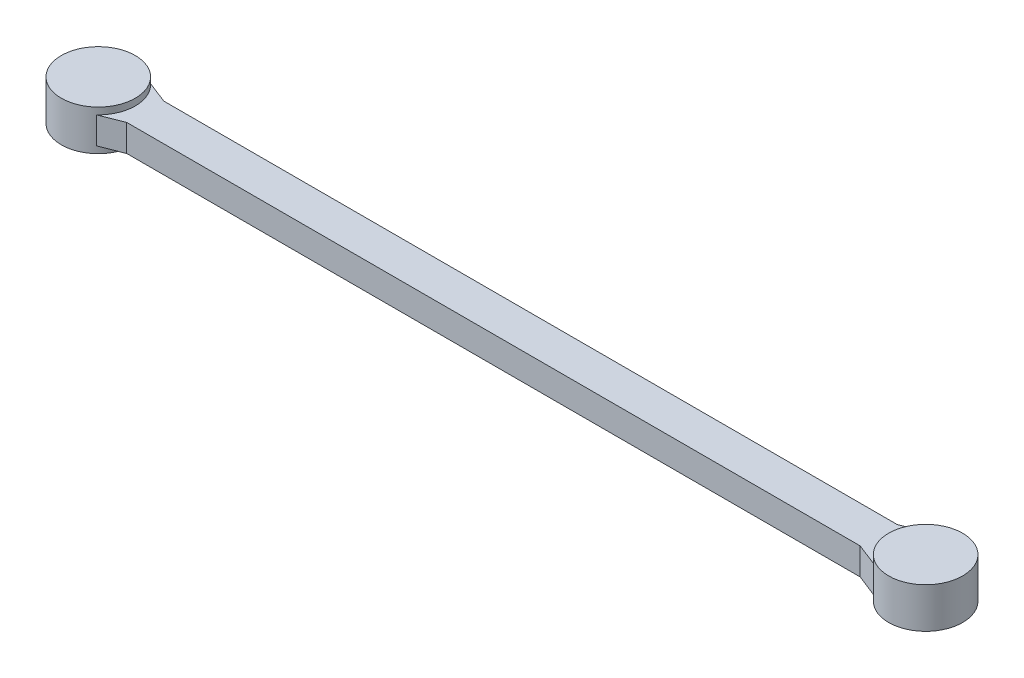
ISO-10303-21;
HEADER;
FILE_DESCRIPTION(('STEP AP214'),'2;1');
FILE_NAME('part.step','',(''),(''),'','','');
FILE_SCHEMA(('AUTOMOTIVE_DESIGN { 1 0 10303 214 1 1 1 1 }'));
ENDSEC;
DATA;
#1=APPLICATION_CONTEXT('core data for automotive mechanical design processes');
#2=APPLICATION_PROTOCOL_DEFINITION('international standard','automotive_design',2000,#1);
#3=PRODUCT_CONTEXT('',#1,'mechanical');
#4=PRODUCT('Part','Part','',(#3));
#5=PRODUCT_RELATED_PRODUCT_CATEGORY('part','',(#4));
#6=PRODUCT_DEFINITION_FORMATION('','',#4);
#7=PRODUCT_DEFINITION_CONTEXT('part definition',#1,'design');
#8=PRODUCT_DEFINITION('design','',#6,#7);
#9=PRODUCT_DEFINITION_SHAPE('','',#8);
#10=(LENGTH_UNIT() NAMED_UNIT(*) SI_UNIT(.MILLI.,.METRE.));
#11=(NAMED_UNIT(*) PLANE_ANGLE_UNIT() SI_UNIT($,.RADIAN.));
#12=(NAMED_UNIT(*) SI_UNIT($,.STERADIAN.) SOLID_ANGLE_UNIT());
#13=UNCERTAINTY_MEASURE_WITH_UNIT(LENGTH_MEASURE(1.E-05),#10,'distance_accuracy_value','');
#14=(GEOMETRIC_REPRESENTATION_CONTEXT(3) GLOBAL_UNCERTAINTY_ASSIGNED_CONTEXT((#13)) GLOBAL_UNIT_ASSIGNED_CONTEXT((#10,
#11,#12)) REPRESENTATION_CONTEXT('',''));
#15=CARTESIAN_POINT('',(0.,0.,0.));
#16=DIRECTION('',(0.,0.,1.));
#17=DIRECTION('',(1.,0.,0.));
#18=AXIS2_PLACEMENT_3D('',#15,#16,#17);
#19=CARTESIAN_POINT('',(545.,40.,0.));
#20=DIRECTION('',(0.366666666666667,0.,0.930352382463524));
#21=DIRECTION('',(0.930352382463524,0.,-0.366666666666667));
#22=AXIS2_PLACEMENT_3D('',#19,#20,#21);
#23=PLANE('',#22);
#24=DIRECTION('',(-0.930352382463524,0.,0.366666666666667));
#25=VECTOR('',#24,1.);
#26=CARTESIAN_POINT('',(545.,40.,0.));
#27=LINE('',#26,#25);
#28=CARTESIAN_POINT('',(577.252215925402,40.,-12.7111111111111));
#29=VERTEX_POINT('',#28);
#30=CARTESIAN_POINT('',(545.,40.,0.));
#31=VERTEX_POINT('',#30);
#32=EDGE_CURVE('E117',#29,#31,#27,.T.);
#33=ORIENTED_EDGE('',*,*,#32,.F.);
#34=DIRECTION('',(0.,1.,0.));
#35=VECTOR('',#34,1.);
#36=CARTESIAN_POINT('',(577.252215925402,-10.,-12.7111111111112));
#37=LINE('',#36,#35);
#38=CARTESIAN_POINT('',(577.252215925402,0.,-12.7111111111111));
#39=VERTEX_POINT('',#38);
#40=EDGE_CURVE('E116',#29,#39,#37,.F.);
#41=ORIENTED_EDGE('',*,*,#40,.T.);
#42=DIRECTION('',(-0.930352382463524,0.,0.366666666666667));
#43=VECTOR('',#42,1.);
#44=CARTESIAN_POINT('',(545.,0.,0.));
#45=LINE('',#44,#43);
#46=CARTESIAN_POINT('',(545.,0.,0.));
#47=VERTEX_POINT('',#46);
#48=EDGE_CURVE('E104',#39,#47,#45,.T.);
#49=ORIENTED_EDGE('',*,*,#48,.T.);
#50=DIRECTION('',(0.,-1.,0.));
#51=VECTOR('',#50,1.);
#52=CARTESIAN_POINT('',(545.,40.,0.));
#53=LINE('',#52,#51);
#54=EDGE_CURVE('E172',#31,#47,#53,.T.);
#55=ORIENTED_EDGE('',*,*,#54,.F.);
#56=EDGE_LOOP('',(#33,#41,#49,#55));
#57=FACE_BOUND('',#56,.T.);
#58=ADVANCED_FACE('F39',(#57),#23,.F.);
#59=CARTESIAN_POINT('',(-545.,40.,0.));
#60=DIRECTION('',(0.,0.,1.));
#61=DIRECTION('',(1.,0.,0.));
#62=AXIS2_PLACEMENT_3D('',#59,#60,#61);
#63=PLANE('',#62);
#64=DIRECTION('',(-1.,0.,0.));
#65=VECTOR('',#64,1.);
#66=CARTESIAN_POINT('',(-545.,0.,0.));
#67=LINE('',#66,#65);
#68=CARTESIAN_POINT('',(-545.,0.,0.));
#69=VERTEX_POINT('',#68);
#70=EDGE_CURVE('E109',#47,#69,#67,.T.);
#71=ORIENTED_EDGE('',*,*,#70,.T.);
#72=DIRECTION('',(0.,-1.,0.));
#73=VECTOR('',#72,1.);
#74=CARTESIAN_POINT('',(-545.,40.,0.));
#75=LINE('',#74,#73);
#76=CARTESIAN_POINT('',(-545.,40.,0.));
#77=VERTEX_POINT('',#76);
#78=EDGE_CURVE('E169',#77,#69,#75,.T.);
#79=ORIENTED_EDGE('',*,*,#78,.F.);
#80=DIRECTION('',(-1.,0.,0.));
#81=VECTOR('',#80,1.);
#82=CARTESIAN_POINT('',(-545.,40.,0.));
#83=LINE('',#82,#81);
#84=EDGE_CURVE('E142',#31,#77,#83,.T.);
#85=ORIENTED_EDGE('',*,*,#84,.F.);
#86=ORIENTED_EDGE('',*,*,#54,.T.);
#87=EDGE_LOOP('',(#71,#79,#85,#86));
#88=FACE_BOUND('',#87,.T.);
#89=ADVANCED_FACE('F186',(#88),#63,.F.);
#90=CARTESIAN_POINT('',(-545.,40.,0.));
#91=DIRECTION('',(-0.366666666666667,0.,0.930352382463524));
#92=DIRECTION('',(0.930352382463524,0.,0.366666666666667));
#93=AXIS2_PLACEMENT_3D('',#90,#91,#92);
#94=PLANE('',#93);
#95=DIRECTION('',(-0.930352382463524,0.,-0.366666666666667));
#96=VECTOR('',#95,1.);
#97=CARTESIAN_POINT('',(-545.,0.,0.));
#98=LINE('',#97,#96);
#99=CARTESIAN_POINT('',(-577.252215925402,0.,-12.711111111111));
#100=VERTEX_POINT('',#99);
#101=EDGE_CURVE('E156',#69,#100,#98,.T.);
#102=ORIENTED_EDGE('',*,*,#101,.T.);
#103=DIRECTION('',(0.,1.,0.));
#104=VECTOR('',#103,1.);
#105=CARTESIAN_POINT('',(-577.252215925402,-10.,-12.7111111111111));
#106=LINE('',#105,#104);
#107=CARTESIAN_POINT('',(-577.252215925402,40.,-12.711111111111));
#108=VERTEX_POINT('',#107);
#109=EDGE_CURVE('E138',#100,#108,#106,.T.);
#110=ORIENTED_EDGE('',*,*,#109,.T.);
#111=DIRECTION('',(-0.930352382463524,0.,-0.366666666666667));
#112=VECTOR('',#111,1.);
#113=CARTESIAN_POINT('',(-545.,40.,0.));
#114=LINE('',#113,#112);
#115=EDGE_CURVE('E145',#77,#108,#114,.T.);
#116=ORIENTED_EDGE('',*,*,#115,.F.);
#117=ORIENTED_EDGE('',*,*,#78,.T.);
#118=EDGE_LOOP('',(#102,#110,#116,#117));
#119=FACE_BOUND('',#118,.T.);
#120=ADVANCED_FACE('F181',(#119),#94,.F.);
#121=CARTESIAN_POINT('',(-614.776428684764,40.,82.5));
#122=DIRECTION('',(-0.366666666666667,0.,-0.930352382463524));
#123=DIRECTION('',(-0.930352382463524,0.,0.366666666666667));
#124=AXIS2_PLACEMENT_3D('',#121,#122,#123);
#125=PLANE('',#124);
#126=DIRECTION('',(0.930352382463524,0.,-0.366666666666667));
#127=VECTOR('',#126,1.);
#128=CARTESIAN_POINT('',(-614.776428684764,40.,82.5));
#129=LINE('',#128,#127);
#130=CARTESIAN_POINT('',(-577.252215925402,40.,67.711111111111));
#131=VERTEX_POINT('',#130);
#132=CARTESIAN_POINT('',(-545.,40.,54.9999999999999));
#133=VERTEX_POINT('',#132);
#134=EDGE_CURVE('E148',#131,#133,#129,.T.);
#135=ORIENTED_EDGE('',*,*,#134,.F.);
#136=DIRECTION('',(0.,1.,0.));
#137=VECTOR('',#136,1.);
#138=CARTESIAN_POINT('',(-577.252215925402,-10.,67.711111111111));
#139=LINE('',#138,#137);
#140=CARTESIAN_POINT('',(-577.252215925402,0.,67.711111111111));
#141=VERTEX_POINT('',#140);
#142=EDGE_CURVE('E135',#131,#141,#139,.F.);
#143=ORIENTED_EDGE('',*,*,#142,.T.);
#144=DIRECTION('',(0.930352382463524,0.,-0.366666666666667));
#145=VECTOR('',#144,1.);
#146=CARTESIAN_POINT('',(-614.776428684764,0.,82.5));
#147=LINE('',#146,#145);
#148=CARTESIAN_POINT('',(-545.,0.,54.9999999999999));
#149=VERTEX_POINT('',#148);
#150=EDGE_CURVE('E159',#141,#149,#147,.T.);
#151=ORIENTED_EDGE('',*,*,#150,.T.);
#152=DIRECTION('',(0.,-1.,0.));
#153=VECTOR('',#152,1.);
#154=CARTESIAN_POINT('',(-545.,40.,54.9999999999999));
#155=LINE('',#154,#153);
#156=EDGE_CURVE('E166',#133,#149,#155,.T.);
#157=ORIENTED_EDGE('',*,*,#156,.F.);
#158=EDGE_LOOP('',(#135,#143,#151,#157));
#159=FACE_BOUND('',#158,.T.);
#160=ADVANCED_FACE('F191',(#159),#125,.F.);
#161=CARTESIAN_POINT('',(545.,40.,54.9999999999999));
#162=DIRECTION('',(0.,0.,-1.));
#163=DIRECTION('',(-1.,0.,0.));
#164=AXIS2_PLACEMENT_3D('',#161,#162,#163);
#165=PLANE('',#164);
#166=DIRECTION('',(1.,0.,0.));
#167=VECTOR('',#166,1.);
#168=CARTESIAN_POINT('',(545.,0.,54.9999999999999));
#169=LINE('',#168,#167);
#170=CARTESIAN_POINT('',(545.,0.,54.9999999999999));
#171=VERTEX_POINT('',#170);
#172=EDGE_CURVE('E161',#149,#171,#169,.T.);
#173=ORIENTED_EDGE('',*,*,#172,.T.);
#174=DIRECTION('',(0.,-1.,0.));
#175=VECTOR('',#174,1.);
#176=CARTESIAN_POINT('',(545.,40.,54.9999999999999));
#177=LINE('',#176,#175);
#178=CARTESIAN_POINT('',(545.,40.,54.9999999999999));
#179=VERTEX_POINT('',#178);
#180=EDGE_CURVE('E153',#179,#171,#177,.T.);
#181=ORIENTED_EDGE('',*,*,#180,.F.);
#182=DIRECTION('',(1.,0.,0.));
#183=VECTOR('',#182,1.);
#184=CARTESIAN_POINT('',(545.,40.,54.9999999999999));
#185=LINE('',#184,#183);
#186=EDGE_CURVE('E150',#133,#179,#185,.T.);
#187=ORIENTED_EDGE('',*,*,#186,.F.);
#188=ORIENTED_EDGE('',*,*,#156,.T.);
#189=EDGE_LOOP('',(#173,#181,#187,#188));
#190=FACE_BOUND('',#189,.T.);
#191=ADVANCED_FACE('F195',(#190),#165,.F.);
#192=CARTESIAN_POINT('',(614.776428684764,40.,82.5));
#193=DIRECTION('',(0.366666666666667,0.,-0.930352382463524));
#194=DIRECTION('',(-0.930352382463524,0.,-0.366666666666667));
#195=AXIS2_PLACEMENT_3D('',#192,#193,#194);
#196=PLANE('',#195);
#197=DIRECTION('',(0.930352382463524,0.,0.366666666666667));
#198=VECTOR('',#197,1.);
#199=CARTESIAN_POINT('',(614.776428684764,0.,82.5));
#200=LINE('',#199,#198);
#201=CARTESIAN_POINT('',(577.252215925402,0.,67.7111111111111));
#202=VERTEX_POINT('',#201);
#203=EDGE_CURVE('E143',#171,#202,#200,.T.);
#204=ORIENTED_EDGE('',*,*,#203,.T.);
#205=DIRECTION('',(0.,1.,0.));
#206=VECTOR('',#205,1.);
#207=CARTESIAN_POINT('',(577.252215925402,-10.,67.7111111111111));
#208=LINE('',#207,#206);
#209=CARTESIAN_POINT('',(577.252215925402,40.,67.7111111111111));
#210=VERTEX_POINT('',#209);
#211=EDGE_CURVE('E61',#202,#210,#208,.T.);
#212=ORIENTED_EDGE('',*,*,#211,.T.);
#213=DIRECTION('',(0.930352382463524,0.,0.366666666666667));
#214=VECTOR('',#213,1.);
#215=CARTESIAN_POINT('',(614.776428684764,40.,82.5));
#216=LINE('',#215,#214);
#217=EDGE_CURVE('E152',#179,#210,#216,.T.);
#218=ORIENTED_EDGE('',*,*,#217,.F.);
#219=ORIENTED_EDGE('',*,*,#180,.T.);
#220=EDGE_LOOP('',(#204,#212,#218,#219));
#221=FACE_BOUND('',#220,.T.);
#222=ADVANCED_FACE('F196',(#221),#196,.F.);
#223=CARTESIAN_POINT('',(0.,40.,0.));
#224=DIRECTION('',(0.,-1.,0.));
#225=DIRECTION('',(0.,0.,-1.));
#226=AXIS2_PLACEMENT_3D('',#223,#224,#225);
#227=PLANE('',#226);
#228=ORIENTED_EDGE('',*,*,#217,.T.);
#229=CARTESIAN_POINT('',(614.776428684764,40.,27.5));
#230=DIRECTION('',(0.,-1.,0.));
#231=DIRECTION('',(0.,0.,-1.));
#232=AXIS2_PLACEMENT_3D('',#229,#230,#231);
#233=CIRCLE('',#232,54.9999999999999);
#234=EDGE_CURVE('E53',#210,#29,#233,.T.);
#235=ORIENTED_EDGE('',*,*,#234,.T.);
#236=ORIENTED_EDGE('',*,*,#32,.T.);
#237=ORIENTED_EDGE('',*,*,#84,.T.);
#238=ORIENTED_EDGE('',*,*,#115,.T.);
#239=CARTESIAN_POINT('',(-614.776428684764,40.,27.5));
#240=DIRECTION('',(0.,-1.,0.));
#241=DIRECTION('',(0.,0.,-1.));
#242=AXIS2_PLACEMENT_3D('',#239,#240,#241);
#243=CIRCLE('',#242,55.0000000000001);
#244=EDGE_CURVE('E113',#108,#131,#243,.T.);
#245=ORIENTED_EDGE('',*,*,#244,.T.);
#246=ORIENTED_EDGE('',*,*,#134,.T.);
#247=ORIENTED_EDGE('',*,*,#186,.T.);
#248=EDGE_LOOP('',(#228,#235,#236,#237,#238,#245,#246,#247));
#249=FACE_BOUND('',#248,.T.);
#250=ADVANCED_FACE('F187',(#249),#227,.F.);
#251=CARTESIAN_POINT('',(0.,0.,0.));
#252=DIRECTION('',(0.,-1.,0.));
#253=DIRECTION('',(0.,0.,-1.));
#254=AXIS2_PLACEMENT_3D('',#251,#252,#253);
#255=PLANE('',#254);
#256=CARTESIAN_POINT('',(614.776428684764,0.,27.5));
#257=DIRECTION('',(0.,-1.,0.));
#258=DIRECTION('',(0.,0.,-1.));
#259=AXIS2_PLACEMENT_3D('',#256,#257,#258);
#260=CIRCLE('',#259,54.9999999999999);
#261=EDGE_CURVE('E11',#202,#39,#260,.T.);
#262=ORIENTED_EDGE('',*,*,#261,.F.);
#263=ORIENTED_EDGE('',*,*,#203,.F.);
#264=ORIENTED_EDGE('',*,*,#172,.F.);
#265=ORIENTED_EDGE('',*,*,#150,.F.);
#266=CARTESIAN_POINT('',(-614.776428684764,0.,27.5));
#267=DIRECTION('',(0.,-1.,0.));
#268=DIRECTION('',(0.,0.,-1.));
#269=AXIS2_PLACEMENT_3D('',#266,#267,#268);
#270=CIRCLE('',#269,55.0000000000001);
#271=EDGE_CURVE('E46',#100,#141,#270,.T.);
#272=ORIENTED_EDGE('',*,*,#271,.F.);
#273=ORIENTED_EDGE('',*,*,#101,.F.);
#274=ORIENTED_EDGE('',*,*,#70,.F.);
#275=ORIENTED_EDGE('',*,*,#48,.F.);
#276=EDGE_LOOP('',(#262,#263,#264,#265,#272,#273,#274,#275));
#277=FACE_BOUND('',#276,.T.);
#278=ADVANCED_FACE('F106',(#277),#255,.T.);
#279=CARTESIAN_POINT('',(-614.776428684764,-10.,27.5));
#280=DIRECTION('',(0.,1.,0.));
#281=DIRECTION('',(0.,0.,1.));
#282=AXIS2_PLACEMENT_3D('',#279,#280,#281);
#283=CYLINDRICAL_SURFACE('',#282,55.0000000000001);
#284=CARTESIAN_POINT('',(-614.776428684764,50.,27.5));
#285=DIRECTION('',(0.,1.,0.));
#286=DIRECTION('',(0.,0.,1.));
#287=AXIS2_PLACEMENT_3D('',#284,#285,#286);
#288=CIRCLE('',#287,55.0000000000001);
#289=CARTESIAN_POINT('',(-614.776428684764,50.,82.5));
#290=VERTEX_POINT('',#289);
#291=EDGE_CURVE('E129',#290,#290,#288,.T.);
#292=ORIENTED_EDGE('',*,*,#291,.F.);
#293=EDGE_LOOP('',(#292));
#294=FACE_BOUND('',#293,.T.);
#295=CARTESIAN_POINT('',(-614.776428684764,-10.,27.5));
#296=DIRECTION('',(0.,1.,0.));
#297=DIRECTION('',(0.,0.,1.));
#298=AXIS2_PLACEMENT_3D('',#295,#296,#297);
#299=CIRCLE('',#298,55.0000000000001);
#300=CARTESIAN_POINT('',(-614.776428684764,-10.,82.5));
#301=VERTEX_POINT('',#300);
#302=EDGE_CURVE('E132',#301,#301,#299,.T.);
#303=ORIENTED_EDGE('',*,*,#302,.T.);
#304=EDGE_LOOP('',(#303));
#305=FACE_BOUND('',#304,.T.);
#306=ORIENTED_EDGE('',*,*,#244,.F.);
#307=ORIENTED_EDGE('',*,*,#109,.F.);
#308=ORIENTED_EDGE('',*,*,#271,.T.);
#309=ORIENTED_EDGE('',*,*,#142,.F.);
#310=EDGE_LOOP('',(#306,#307,#308,#309));
#311=FACE_BOUND('',#310,.T.);
#312=ADVANCED_FACE('F178',(#294,#305,#311),#283,.T.);
#313=CARTESIAN_POINT('',(-614.776428684764,-10.,27.5));
#314=DIRECTION('',(0.,1.,0.));
#315=DIRECTION('',(0.,0.,1.));
#316=AXIS2_PLACEMENT_3D('',#313,#314,#315);
#317=PLANE('',#316);
#318=ORIENTED_EDGE('',*,*,#302,.F.);
#319=EDGE_LOOP('',(#318));
#320=FACE_BOUND('',#319,.T.);
#321=ADVANCED_FACE('F263',(#320),#317,.F.);
#322=CARTESIAN_POINT('',(-614.776428684764,50.,27.5));
#323=DIRECTION('',(0.,1.,0.));
#324=DIRECTION('',(0.,0.,1.));
#325=AXIS2_PLACEMENT_3D('',#322,#323,#324);
#326=PLANE('',#325);
#327=ORIENTED_EDGE('',*,*,#291,.T.);
#328=EDGE_LOOP('',(#327));
#329=FACE_BOUND('',#328,.T.);
#330=ADVANCED_FACE('F272',(#329),#326,.T.);
#331=CARTESIAN_POINT('',(614.776428684764,-10.,27.5));
#332=DIRECTION('',(0.,1.,0.));
#333=DIRECTION('',(0.,0.,1.));
#334=AXIS2_PLACEMENT_3D('',#331,#332,#333);
#335=CYLINDRICAL_SURFACE('',#334,54.9999999999999);
#336=CARTESIAN_POINT('',(614.776428684764,50.,27.5));
#337=DIRECTION('',(0.,1.,0.));
#338=DIRECTION('',(0.,0.,1.));
#339=AXIS2_PLACEMENT_3D('',#336,#337,#338);
#340=CIRCLE('',#339,54.9999999999999);
#341=CARTESIAN_POINT('',(614.776428684764,50.,82.4999999999999));
#342=VERTEX_POINT('',#341);
#343=EDGE_CURVE('E124',#342,#342,#340,.T.);
#344=ORIENTED_EDGE('',*,*,#343,.F.);
#345=EDGE_LOOP('',(#344));
#346=FACE_BOUND('',#345,.T.);
#347=CARTESIAN_POINT('',(614.776428684764,-10.,27.5));
#348=DIRECTION('',(0.,1.,0.));
#349=DIRECTION('',(0.,0.,1.));
#350=AXIS2_PLACEMENT_3D('',#347,#348,#349);
#351=CIRCLE('',#350,54.9999999999999);
#352=CARTESIAN_POINT('',(614.776428684764,-10.,82.4999999999999));
#353=VERTEX_POINT('',#352);
#354=EDGE_CURVE('E121',#353,#353,#351,.T.);
#355=ORIENTED_EDGE('',*,*,#354,.T.);
#356=EDGE_LOOP('',(#355));
#357=FACE_BOUND('',#356,.T.);
#358=ORIENTED_EDGE('',*,*,#234,.F.);
#359=ORIENTED_EDGE('',*,*,#211,.F.);
#360=ORIENTED_EDGE('',*,*,#261,.T.);
#361=ORIENTED_EDGE('',*,*,#40,.F.);
#362=EDGE_LOOP('',(#358,#359,#360,#361));
#363=FACE_BOUND('',#362,.T.);
#364=ADVANCED_FACE('F120',(#346,#357,#363),#335,.T.);
#365=CARTESIAN_POINT('',(614.776428684764,-10.,27.5));
#366=DIRECTION('',(0.,1.,0.));
#367=DIRECTION('',(0.,0.,1.));
#368=AXIS2_PLACEMENT_3D('',#365,#366,#367);
#369=PLANE('',#368);
#370=ORIENTED_EDGE('',*,*,#354,.F.);
#371=EDGE_LOOP('',(#370));
#372=FACE_BOUND('',#371,.T.);
#373=ADVANCED_FACE('F291',(#372),#369,.F.);
#374=CARTESIAN_POINT('',(614.776428684764,50.,27.5));
#375=DIRECTION('',(0.,1.,0.));
#376=DIRECTION('',(0.,0.,1.));
#377=AXIS2_PLACEMENT_3D('',#374,#375,#376);
#378=PLANE('',#377);
#379=ORIENTED_EDGE('',*,*,#343,.T.);
#380=EDGE_LOOP('',(#379));
#381=FACE_BOUND('',#380,.T.);
#382=ADVANCED_FACE('F300',(#381),#378,.T.);
#383=CLOSED_SHELL('',(#58,#89,#120,#160,#191,#222,#250,#278,#312,#321,#330,#364,#373,#382));
#384=MANIFOLD_SOLID_BREP('B2',#383);
#385=ADVANCED_BREP_SHAPE_REPRESENTATION('',(#18,#384),#14);
#386=SHAPE_DEFINITION_REPRESENTATION(#9,#385);
ENDSEC;
END-ISO-10303-21;
